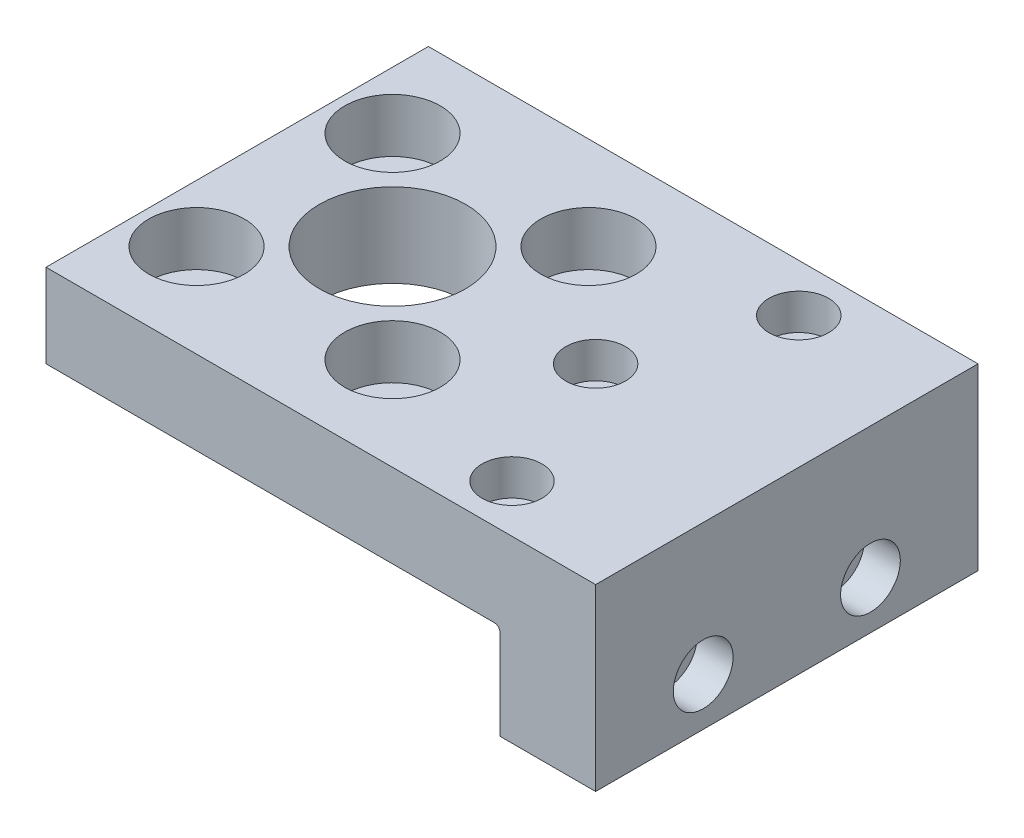
ISO-10303-21;
HEADER;
FILE_DESCRIPTION(('STEP AP214'),'2;1');
FILE_NAME('part.step','',(''),(''),'','','');
FILE_SCHEMA(('AUTOMOTIVE_DESIGN { 1 0 10303 214 1 1 1 1 }'));
ENDSEC;
DATA;
#1=APPLICATION_CONTEXT('core data for automotive mechanical design processes');
#2=APPLICATION_PROTOCOL_DEFINITION('international standard','automotive_design',2000,#1);
#3=PRODUCT_CONTEXT('',#1,'mechanical');
#4=PRODUCT('Part','Part','',(#3));
#5=PRODUCT_RELATED_PRODUCT_CATEGORY('part','',(#4));
#6=PRODUCT_DEFINITION_FORMATION('','',#4);
#7=PRODUCT_DEFINITION_CONTEXT('part definition',#1,'design');
#8=PRODUCT_DEFINITION('design','',#6,#7);
#9=PRODUCT_DEFINITION_SHAPE('','',#8);
#10=(LENGTH_UNIT() NAMED_UNIT(*) SI_UNIT(.MILLI.,.METRE.));
#11=(NAMED_UNIT(*) PLANE_ANGLE_UNIT() SI_UNIT($,.RADIAN.));
#12=(NAMED_UNIT(*) SI_UNIT($,.STERADIAN.) SOLID_ANGLE_UNIT());
#13=UNCERTAINTY_MEASURE_WITH_UNIT(LENGTH_MEASURE(1.E-05),#10,'distance_accuracy_value','');
#14=(GEOMETRIC_REPRESENTATION_CONTEXT(3) GLOBAL_UNCERTAINTY_ASSIGNED_CONTEXT((#13)) GLOBAL_UNIT_ASSIGNED_CONTEXT((#10,
#11,#12)) REPRESENTATION_CONTEXT('',''));
#15=CARTESIAN_POINT('',(0.,0.,0.));
#16=DIRECTION('',(0.,0.,1.));
#17=DIRECTION('',(1.,0.,0.));
#18=AXIS2_PLACEMENT_3D('',#15,#16,#17);
#19=CARTESIAN_POINT('',(-73.025,-23.8125,-22.225));
#20=DIRECTION('',(1.,0.,0.));
#21=DIRECTION('',(0.,0.,-1.));
#22=AXIS2_PLACEMENT_3D('',#19,#20,#21);
#23=CYLINDRICAL_SURFACE('',#22,5.1562);
#24=CARTESIAN_POINT('',(47.625,-23.8125,-22.225));
#25=DIRECTION('',(1.,0.,0.));
#26=DIRECTION('',(0.,0.,-1.));
#27=AXIS2_PLACEMENT_3D('',#24,#25,#26);
#28=CIRCLE('',#27,5.1562);
#29=CARTESIAN_POINT('',(47.625,-23.8125,-27.3812));
#30=VERTEX_POINT('',#29);
#31=EDGE_CURVE('E185',#30,#30,#28,.T.);
#32=ORIENTED_EDGE('',*,*,#31,.F.);
#33=EDGE_LOOP('',(#32));
#34=FACE_BOUND('',#33,.T.);
#35=CARTESIAN_POINT('',(63.5,-23.8125,-22.225));
#36=DIRECTION('',(1.,0.,0.));
#37=DIRECTION('',(0.,0.,-1.));
#38=AXIS2_PLACEMENT_3D('',#35,#36,#37);
#39=CIRCLE('',#38,5.1562);
#40=CARTESIAN_POINT('',(63.5,-23.8125,-27.3812));
#41=VERTEX_POINT('',#40);
#42=EDGE_CURVE('E45',#41,#41,#39,.F.);
#43=ORIENTED_EDGE('',*,*,#42,.F.);
#44=EDGE_LOOP('',(#43));
#45=FACE_BOUND('',#44,.T.);
#46=ADVANCED_FACE('F41',(#34,#45),#23,.F.);
#47=CARTESIAN_POINT('',(-73.025,-23.8125,22.225));
#48=DIRECTION('',(1.,0.,0.));
#49=DIRECTION('',(0.,0.,-1.));
#50=AXIS2_PLACEMENT_3D('',#47,#48,#49);
#51=CYLINDRICAL_SURFACE('',#50,5.1562);
#52=CARTESIAN_POINT('',(47.625,-23.8125,22.225));
#53=DIRECTION('',(1.,0.,0.));
#54=DIRECTION('',(0.,0.,-1.));
#55=AXIS2_PLACEMENT_3D('',#52,#53,#54);
#56=CIRCLE('',#55,5.1562);
#57=CARTESIAN_POINT('',(47.625,-23.8125,17.0688));
#58=VERTEX_POINT('',#57);
#59=EDGE_CURVE('E188',#58,#58,#56,.T.);
#60=ORIENTED_EDGE('',*,*,#59,.F.);
#61=EDGE_LOOP('',(#60));
#62=FACE_BOUND('',#61,.T.);
#63=CARTESIAN_POINT('',(63.5,-23.8125,22.225));
#64=DIRECTION('',(1.,0.,0.));
#65=DIRECTION('',(0.,0.,-1.));
#66=AXIS2_PLACEMENT_3D('',#63,#64,#65);
#67=CIRCLE('',#66,5.1562);
#68=CARTESIAN_POINT('',(63.5,-23.8125,17.0688));
#69=VERTEX_POINT('',#68);
#70=EDGE_CURVE('E191',#69,#69,#67,.F.);
#71=ORIENTED_EDGE('',*,*,#70,.F.);
#72=EDGE_LOOP('',(#71));
#73=FACE_BOUND('',#72,.T.);
#74=ADVANCED_FACE('F311',(#62,#73),#51,.F.);
#75=CARTESIAN_POINT('',(22.225,-36.5125,0.));
#76=DIRECTION('',(0.,1.,0.));
#77=DIRECTION('',(0.,0.,1.));
#78=AXIS2_PLACEMENT_3D('',#75,#76,#77);
#79=CYLINDRICAL_SURFACE('',#78,5.1562);
#80=CARTESIAN_POINT('',(22.225,-11.1125,0.));
#81=DIRECTION('',(0.,-1.,0.));
#82=DIRECTION('',(0.,0.,-1.));
#83=AXIS2_PLACEMENT_3D('',#80,#81,#82);
#84=CIRCLE('',#83,5.1562);
#85=CARTESIAN_POINT('',(22.225,-11.1125,-5.1562));
#86=VERTEX_POINT('',#85);
#87=EDGE_CURVE('E183',#86,#86,#84,.T.);
#88=ORIENTED_EDGE('',*,*,#87,.T.);
#89=EDGE_LOOP('',(#88));
#90=FACE_BOUND('',#89,.T.);
#91=CARTESIAN_POINT('',(22.225,1.5875,0.));
#92=DIRECTION('',(0.,1.,0.));
#93=DIRECTION('',(0.,0.,1.));
#94=AXIS2_PLACEMENT_3D('',#91,#92,#93);
#95=CIRCLE('',#94,5.1562);
#96=CARTESIAN_POINT('',(22.225,1.5875,5.1562));
#97=VERTEX_POINT('',#96);
#98=EDGE_CURVE('E180',#97,#97,#95,.F.);
#99=ORIENTED_EDGE('',*,*,#98,.F.);
#100=EDGE_LOOP('',(#99));
#101=FACE_BOUND('',#100,.T.);
#102=ADVANCED_FACE('F318',(#90,#101),#79,.F.);
#103=CARTESIAN_POINT('',(38.1,-36.5125,-38.1));
#104=DIRECTION('',(0.,1.,0.));
#105=DIRECTION('',(0.,0.,1.));
#106=AXIS2_PLACEMENT_3D('',#103,#104,#105);
#107=CYLINDRICAL_SURFACE('',#106,5.1562);
#108=CARTESIAN_POINT('',(38.1,-11.1125,-38.1));
#109=DIRECTION('',(0.,-1.,0.));
#110=DIRECTION('',(0.,0.,-1.));
#111=AXIS2_PLACEMENT_3D('',#108,#109,#110);
#112=CIRCLE('',#111,5.1562);
#113=CARTESIAN_POINT('',(38.1,-11.1125,-43.2562));
#114=VERTEX_POINT('',#113);
#115=EDGE_CURVE('E179',#114,#114,#112,.T.);
#116=ORIENTED_EDGE('',*,*,#115,.T.);
#117=EDGE_LOOP('',(#116));
#118=FACE_BOUND('',#117,.T.);
#119=CARTESIAN_POINT('',(38.1,1.5875,-38.1));
#120=DIRECTION('',(0.,1.,0.));
#121=DIRECTION('',(0.,0.,1.));
#122=AXIS2_PLACEMENT_3D('',#119,#120,#121);
#123=CIRCLE('',#122,5.1562);
#124=CARTESIAN_POINT('',(38.1,1.5875,-32.9438));
#125=VERTEX_POINT('',#124);
#126=EDGE_CURVE('E175',#125,#125,#123,.F.);
#127=ORIENTED_EDGE('',*,*,#126,.F.);
#128=EDGE_LOOP('',(#127));
#129=FACE_BOUND('',#128,.T.);
#130=ADVANCED_FACE('F337',(#118,#129),#107,.F.);
#131=CARTESIAN_POINT('',(38.1,-36.5125,38.1));
#132=DIRECTION('',(0.,1.,0.));
#133=DIRECTION('',(0.,0.,1.));
#134=AXIS2_PLACEMENT_3D('',#131,#132,#133);
#135=CYLINDRICAL_SURFACE('',#134,5.1562);
#136=CARTESIAN_POINT('',(38.1,-11.1125,38.1));
#137=DIRECTION('',(0.,-1.,0.));
#138=DIRECTION('',(0.,0.,-1.));
#139=AXIS2_PLACEMENT_3D('',#136,#137,#138);
#140=CIRCLE('',#139,5.1562);
#141=CARTESIAN_POINT('',(38.1,-11.1125,32.9438));
#142=VERTEX_POINT('',#141);
#143=EDGE_CURVE('E230',#142,#142,#140,.T.);
#144=ORIENTED_EDGE('',*,*,#143,.T.);
#145=EDGE_LOOP('',(#144));
#146=FACE_BOUND('',#145,.T.);
#147=CARTESIAN_POINT('',(38.1,1.5875,38.1));
#148=DIRECTION('',(0.,1.,0.));
#149=DIRECTION('',(0.,0.,1.));
#150=AXIS2_PLACEMENT_3D('',#147,#148,#149);
#151=CIRCLE('',#150,5.1562);
#152=CARTESIAN_POINT('',(38.1,1.5875,43.2562));
#153=VERTEX_POINT('',#152);
#154=EDGE_CURVE('E172',#153,#153,#151,.F.);
#155=ORIENTED_EDGE('',*,*,#154,.F.);
#156=EDGE_LOOP('',(#155));
#157=FACE_BOUND('',#156,.T.);
#158=ADVANCED_FACE('F355',(#146,#157),#135,.F.);
#159=CARTESIAN_POINT('',(-57.785,-36.5125,26.035));
#160=DIRECTION('',(0.,1.,0.));
#161=DIRECTION('',(0.,0.,1.));
#162=AXIS2_PLACEMENT_3D('',#159,#160,#161);
#163=CYLINDRICAL_SURFACE('',#162,6.7437);
#164=CARTESIAN_POINT('',(-57.785,-11.1125,26.035));
#165=DIRECTION('',(0.,-1.,0.));
#166=DIRECTION('',(0.,0.,-1.));
#167=AXIS2_PLACEMENT_3D('',#164,#165,#166);
#168=CIRCLE('',#167,6.7437);
#169=CARTESIAN_POINT('',(-57.785,-11.1125,19.2913));
#170=VERTEX_POINT('',#169);
#171=EDGE_CURVE('E171',#170,#170,#168,.T.);
#172=ORIENTED_EDGE('',*,*,#171,.T.);
#173=EDGE_LOOP('',(#172));
#174=FACE_BOUND('',#173,.T.);
#175=CARTESIAN_POINT('',(-57.785,-3.175,26.035));
#176=DIRECTION('',(0.,1.,0.));
#177=DIRECTION('',(0.,0.,1.));
#178=AXIS2_PLACEMENT_3D('',#175,#176,#177);
#179=CIRCLE('',#178,6.7437);
#180=CARTESIAN_POINT('',(-57.785,-3.175,32.7787));
#181=VERTEX_POINT('',#180);
#182=EDGE_CURVE('E168',#181,#181,#179,.F.);
#183=ORIENTED_EDGE('',*,*,#182,.F.);
#184=EDGE_LOOP('',(#183));
#185=FACE_BOUND('',#184,.T.);
#186=ADVANCED_FACE('F358',(#174,#185),#163,.F.);
#187=CARTESIAN_POINT('',(-5.715,-36.5125,-26.035));
#188=DIRECTION('',(0.,1.,0.));
#189=DIRECTION('',(0.,0.,1.));
#190=AXIS2_PLACEMENT_3D('',#187,#188,#189);
#191=CYLINDRICAL_SURFACE('',#190,6.7437);
#192=CARTESIAN_POINT('',(-5.715,-11.1125,-26.035));
#193=DIRECTION('',(0.,-1.,0.));
#194=DIRECTION('',(0.,0.,-1.));
#195=AXIS2_PLACEMENT_3D('',#192,#193,#194);
#196=CIRCLE('',#195,6.7437);
#197=CARTESIAN_POINT('',(-5.715,-11.1125,-32.7787));
#198=VERTEX_POINT('',#197);
#199=EDGE_CURVE('E258',#198,#198,#196,.T.);
#200=ORIENTED_EDGE('',*,*,#199,.T.);
#201=EDGE_LOOP('',(#200));
#202=FACE_BOUND('',#201,.T.);
#203=CARTESIAN_POINT('',(-5.715,-3.175,-26.035));
#204=DIRECTION('',(0.,1.,0.));
#205=DIRECTION('',(0.,0.,1.));
#206=AXIS2_PLACEMENT_3D('',#203,#204,#205);
#207=CIRCLE('',#206,6.7437);
#208=CARTESIAN_POINT('',(-5.715,-3.175,-19.2913));
#209=VERTEX_POINT('',#208);
#210=EDGE_CURVE('E165',#209,#209,#207,.F.);
#211=ORIENTED_EDGE('',*,*,#210,.F.);
#212=EDGE_LOOP('',(#211));
#213=FACE_BOUND('',#212,.T.);
#214=ADVANCED_FACE('F393',(#202,#213),#191,.F.);
#215=CARTESIAN_POINT('',(-57.785,-36.5125,-26.035));
#216=DIRECTION('',(0.,1.,0.));
#217=DIRECTION('',(0.,0.,1.));
#218=AXIS2_PLACEMENT_3D('',#215,#216,#217);
#219=CYLINDRICAL_SURFACE('',#218,6.7437);
#220=CARTESIAN_POINT('',(-57.785,-11.1125,-26.035));
#221=DIRECTION('',(0.,-1.,0.));
#222=DIRECTION('',(0.,0.,-1.));
#223=AXIS2_PLACEMENT_3D('',#220,#221,#222);
#224=CIRCLE('',#223,6.7437);
#225=CARTESIAN_POINT('',(-57.785,-11.1125,-32.7787));
#226=VERTEX_POINT('',#225);
#227=EDGE_CURVE('E261',#226,#226,#224,.T.);
#228=ORIENTED_EDGE('',*,*,#227,.T.);
#229=EDGE_LOOP('',(#228));
#230=FACE_BOUND('',#229,.T.);
#231=CARTESIAN_POINT('',(-57.785,-3.175,-26.035));
#232=DIRECTION('',(0.,1.,0.));
#233=DIRECTION('',(0.,0.,1.));
#234=AXIS2_PLACEMENT_3D('',#231,#232,#233);
#235=CIRCLE('',#234,6.7437);
#236=CARTESIAN_POINT('',(-57.785,-3.175,-19.2913));
#237=VERTEX_POINT('',#236);
#238=EDGE_CURVE('E161',#237,#237,#235,.F.);
#239=ORIENTED_EDGE('',*,*,#238,.F.);
#240=EDGE_LOOP('',(#239));
#241=FACE_BOUND('',#240,.T.);
#242=ADVANCED_FACE('F396',(#230,#241),#219,.F.);
#243=CARTESIAN_POINT('',(-5.715,-36.5125,26.035));
#244=DIRECTION('',(0.,1.,0.));
#245=DIRECTION('',(0.,0.,1.));
#246=AXIS2_PLACEMENT_3D('',#243,#244,#245);
#247=CYLINDRICAL_SURFACE('',#246,6.7437);
#248=CARTESIAN_POINT('',(-5.715,-11.1125,26.035));
#249=DIRECTION('',(0.,-1.,0.));
#250=DIRECTION('',(0.,0.,-1.));
#251=AXIS2_PLACEMENT_3D('',#248,#249,#250);
#252=CIRCLE('',#251,6.7437);
#253=CARTESIAN_POINT('',(-5.715,-11.1125,19.2913));
#254=VERTEX_POINT('',#253);
#255=EDGE_CURVE('E264',#254,#254,#252,.T.);
#256=ORIENTED_EDGE('',*,*,#255,.T.);
#257=EDGE_LOOP('',(#256));
#258=FACE_BOUND('',#257,.T.);
#259=CARTESIAN_POINT('',(-5.715,-3.175,26.035));
#260=DIRECTION('',(0.,1.,0.));
#261=DIRECTION('',(0.,0.,1.));
#262=AXIS2_PLACEMENT_3D('',#259,#260,#261);
#263=CIRCLE('',#262,6.7437);
#264=CARTESIAN_POINT('',(-5.715,-3.175,32.7787));
#265=VERTEX_POINT('',#264);
#266=EDGE_CURVE('E158',#265,#265,#263,.F.);
#267=ORIENTED_EDGE('',*,*,#266,.F.);
#268=EDGE_LOOP('',(#267));
#269=FACE_BOUND('',#268,.T.);
#270=ADVANCED_FACE('F398',(#258,#269),#247,.F.);
#271=CARTESIAN_POINT('',(0.,-11.1125,0.));
#272=DIRECTION('',(0.,-1.,0.));
#273=DIRECTION('',(0.,0.,-1.));
#274=AXIS2_PLACEMENT_3D('',#271,#272,#273);
#275=PLANE('',#274);
#276=ORIENTED_EDGE('',*,*,#87,.F.);
#277=EDGE_LOOP('',(#276));
#278=FACE_BOUND('',#277,.T.);
#279=ORIENTED_EDGE('',*,*,#143,.F.);
#280=EDGE_LOOP('',(#279));
#281=FACE_BOUND('',#280,.T.);
#282=ORIENTED_EDGE('',*,*,#115,.F.);
#283=EDGE_LOOP('',(#282));
#284=FACE_BOUND('',#283,.T.);
#285=ORIENTED_EDGE('',*,*,#255,.F.);
#286=EDGE_LOOP('',(#285));
#287=FACE_BOUND('',#286,.T.);
#288=ORIENTED_EDGE('',*,*,#227,.F.);
#289=EDGE_LOOP('',(#288));
#290=FACE_BOUND('',#289,.T.);
#291=ORIENTED_EDGE('',*,*,#199,.F.);
#292=EDGE_LOOP('',(#291));
#293=FACE_BOUND('',#292,.T.);
#294=ORIENTED_EDGE('',*,*,#171,.F.);
#295=EDGE_LOOP('',(#294));
#296=FACE_BOUND('',#295,.T.);
#297=CARTESIAN_POINT('',(-31.75,-11.1125,0.));
#298=DIRECTION('',(0.,-1.,0.));
#299=DIRECTION('',(0.,0.,-1.));
#300=AXIS2_PLACEMENT_3D('',#297,#298,#299);
#301=CIRCLE('',#300,19.4437);
#302=CARTESIAN_POINT('',(-31.75,-11.1125,-19.4437));
#303=VERTEX_POINT('',#302);
#304=EDGE_CURVE('E121',#303,#303,#301,.F.);
#305=ORIENTED_EDGE('',*,*,#304,.T.);
#306=EDGE_LOOP('',(#305));
#307=FACE_BOUND('',#306,.T.);
#308=DIRECTION('',(-1.,0.,0.));
#309=VECTOR('',#308,1.);
#310=CARTESIAN_POINT('',(-73.025,-11.1125,-50.8));
#311=LINE('',#310,#309);
#312=CARTESIAN_POINT('',(46.101,-11.1125,-50.8));
#313=VERTEX_POINT('',#312);
#314=CARTESIAN_POINT('',(-73.025,-11.1125,-50.8));
#315=VERTEX_POINT('',#314);
#316=EDGE_CURVE('E105',#313,#315,#311,.T.);
#317=ORIENTED_EDGE('',*,*,#316,.F.);
#318=DIRECTION('',(0.,0.,1.));
#319=VECTOR('',#318,1.);
#320=CARTESIAN_POINT('',(46.101,-11.1125,0.));
#321=LINE('',#320,#319);
#322=CARTESIAN_POINT('',(46.101,-11.1125,50.8));
#323=VERTEX_POINT('',#322);
#324=EDGE_CURVE('E153',#313,#323,#321,.T.);
#325=ORIENTED_EDGE('',*,*,#324,.T.);
#326=DIRECTION('',(1.,0.,0.));
#327=VECTOR('',#326,1.);
#328=CARTESIAN_POINT('',(-73.025,-11.1125,50.8));
#329=LINE('',#328,#327);
#330=CARTESIAN_POINT('',(-73.025,-11.1125,50.8));
#331=VERTEX_POINT('',#330);
#332=EDGE_CURVE('E133',#331,#323,#329,.T.);
#333=ORIENTED_EDGE('',*,*,#332,.F.);
#334=DIRECTION('',(0.,0.,1.));
#335=VECTOR('',#334,1.);
#336=CARTESIAN_POINT('',(-73.025,-11.1125,50.8));
#337=LINE('',#336,#335);
#338=EDGE_CURVE('E141',#315,#331,#337,.T.);
#339=ORIENTED_EDGE('',*,*,#338,.F.);
#340=EDGE_LOOP('',(#317,#325,#333,#339));
#341=FACE_BOUND('',#340,.T.);
#342=ADVANCED_FACE('F271',(#278,#281,#284,#287,#290,#293,#296,#307,#341),#275,.T.);
#343=CARTESIAN_POINT('',(73.025,11.1125,50.8));
#344=DIRECTION('',(-1.,0.,0.));
#345=DIRECTION('',(0.,0.,1.));
#346=AXIS2_PLACEMENT_3D('',#343,#344,#345);
#347=PLANE('',#346);
#348=CARTESIAN_POINT('',(73.025,-23.8125,22.225));
#349=DIRECTION('',(1.,0.,0.));
#350=DIRECTION('',(0.,0.,-1.));
#351=AXIS2_PLACEMENT_3D('',#348,#349,#350);
#352=CIRCLE('',#351,7.9375);
#353=CARTESIAN_POINT('',(73.025,-23.8125,14.2875));
#354=VERTEX_POINT('',#353);
#355=EDGE_CURVE('E198',#354,#354,#352,.T.);
#356=ORIENTED_EDGE('',*,*,#355,.F.);
#357=EDGE_LOOP('',(#356));
#358=FACE_BOUND('',#357,.T.);
#359=CARTESIAN_POINT('',(73.025,-23.8125,-22.225));
#360=DIRECTION('',(1.,0.,0.));
#361=DIRECTION('',(0.,0.,-1.));
#362=AXIS2_PLACEMENT_3D('',#359,#360,#361);
#363=CIRCLE('',#362,7.9375);
#364=CARTESIAN_POINT('',(73.025,-23.8125,-30.1625));
#365=VERTEX_POINT('',#364);
#366=EDGE_CURVE('E203',#365,#365,#363,.T.);
#367=ORIENTED_EDGE('',*,*,#366,.F.);
#368=EDGE_LOOP('',(#367));
#369=FACE_BOUND('',#368,.T.);
#370=DIRECTION('',(0.,-1.,0.));
#371=VECTOR('',#370,1.);
#372=CARTESIAN_POINT('',(73.025,11.1125,50.8));
#373=LINE('',#372,#371);
#374=CARTESIAN_POINT('',(73.025,11.1125,50.8));
#375=VERTEX_POINT('',#374);
#376=CARTESIAN_POINT('',(73.025,-36.5125,50.8));
#377=VERTEX_POINT('',#376);
#378=EDGE_CURVE('E139',#375,#377,#373,.T.);
#379=ORIENTED_EDGE('',*,*,#378,.T.);
#380=DIRECTION('',(0.,0.,-1.));
#381=VECTOR('',#380,1.);
#382=CARTESIAN_POINT('',(73.025,-36.5125,50.8));
#383=LINE('',#382,#381);
#384=CARTESIAN_POINT('',(73.025,-36.5125,-50.8));
#385=VERTEX_POINT('',#384);
#386=EDGE_CURVE('E114',#377,#385,#383,.T.);
#387=ORIENTED_EDGE('',*,*,#386,.T.);
#388=DIRECTION('',(0.,-1.,0.));
#389=VECTOR('',#388,1.);
#390=CARTESIAN_POINT('',(73.025,11.1125,-50.8));
#391=LINE('',#390,#389);
#392=CARTESIAN_POINT('',(73.025,11.1125,-50.8));
#393=VERTEX_POINT('',#392);
#394=EDGE_CURVE('E151',#393,#385,#391,.T.);
#395=ORIENTED_EDGE('',*,*,#394,.F.);
#396=DIRECTION('',(0.,0.,-1.));
#397=VECTOR('',#396,1.);
#398=CARTESIAN_POINT('',(73.025,11.1125,50.8));
#399=LINE('',#398,#397);
#400=EDGE_CURVE('E129',#375,#393,#399,.T.);
#401=ORIENTED_EDGE('',*,*,#400,.F.);
#402=EDGE_LOOP('',(#379,#387,#395,#401));
#403=FACE_BOUND('',#402,.T.);
#404=ADVANCED_FACE('F291',(#358,#369,#403),#347,.F.);
#405=CARTESIAN_POINT('',(-73.025,11.1125,-50.8));
#406=DIRECTION('',(0.,0.,1.));
#407=DIRECTION('',(1.,0.,0.));
#408=AXIS2_PLACEMENT_3D('',#405,#406,#407);
#409=PLANE('',#408);
#410=ORIENTED_EDGE('',*,*,#394,.T.);
#411=DIRECTION('',(-1.,0.,0.));
#412=VECTOR('',#411,1.);
#413=CARTESIAN_POINT('',(47.625,-36.5125,-50.8));
#414=LINE('',#413,#412);
#415=CARTESIAN_POINT('',(47.625,-36.5125,-50.8));
#416=VERTEX_POINT('',#415);
#417=EDGE_CURVE('E126',#385,#416,#414,.T.);
#418=ORIENTED_EDGE('',*,*,#417,.T.);
#419=DIRECTION('',(0.,-1.,0.));
#420=VECTOR('',#419,1.);
#421=CARTESIAN_POINT('',(47.625,-11.1125,-50.8));
#422=LINE('',#421,#420);
#423=CARTESIAN_POINT('',(47.625,-12.6365,-50.8));
#424=VERTEX_POINT('',#423);
#425=EDGE_CURVE('E106',#424,#416,#422,.T.);
#426=ORIENTED_EDGE('',*,*,#425,.F.);
#427=CARTESIAN_POINT('',(46.101,-12.6365,-50.8));
#428=DIRECTION('',(0.,0.,1.));
#429=DIRECTION('',(1.,0.,0.));
#430=AXIS2_PLACEMENT_3D('',#427,#428,#429);
#431=CIRCLE('',#430,1.524);
#432=EDGE_CURVE('E11',#424,#313,#431,.T.);
#433=ORIENTED_EDGE('',*,*,#432,.T.);
#434=ORIENTED_EDGE('',*,*,#316,.T.);
#435=DIRECTION('',(0.,-1.,0.));
#436=VECTOR('',#435,1.);
#437=CARTESIAN_POINT('',(-73.025,11.1125,-50.8));
#438=LINE('',#437,#436);
#439=CARTESIAN_POINT('',(-73.025,11.1125,-50.8));
#440=VERTEX_POINT('',#439);
#441=EDGE_CURVE('E148',#440,#315,#438,.T.);
#442=ORIENTED_EDGE('',*,*,#441,.F.);
#443=DIRECTION('',(-1.,0.,0.));
#444=VECTOR('',#443,1.);
#445=CARTESIAN_POINT('',(-73.025,11.1125,-50.8));
#446=LINE('',#445,#444);
#447=EDGE_CURVE('E132',#393,#440,#446,.T.);
#448=ORIENTED_EDGE('',*,*,#447,.F.);
#449=EDGE_LOOP('',(#410,#418,#426,#433,#434,#442,#448));
#450=FACE_BOUND('',#449,.T.);
#451=ADVANCED_FACE('F293',(#450),#409,.F.);
#452=CARTESIAN_POINT('',(-73.025,11.1125,50.8));
#453=DIRECTION('',(1.,0.,0.));
#454=DIRECTION('',(0.,0.,-1.));
#455=AXIS2_PLACEMENT_3D('',#452,#453,#454);
#456=PLANE('',#455);
#457=ORIENTED_EDGE('',*,*,#338,.T.);
#458=DIRECTION('',(0.,-1.,0.));
#459=VECTOR('',#458,1.);
#460=CARTESIAN_POINT('',(-73.025,11.1125,50.8));
#461=LINE('',#460,#459);
#462=CARTESIAN_POINT('',(-73.025,11.1125,50.8));
#463=VERTEX_POINT('',#462);
#464=EDGE_CURVE('E145',#463,#331,#461,.T.);
#465=ORIENTED_EDGE('',*,*,#464,.F.);
#466=DIRECTION('',(0.,0.,1.));
#467=VECTOR('',#466,1.);
#468=CARTESIAN_POINT('',(-73.025,11.1125,50.8));
#469=LINE('',#468,#467);
#470=EDGE_CURVE('E135',#440,#463,#469,.T.);
#471=ORIENTED_EDGE('',*,*,#470,.F.);
#472=ORIENTED_EDGE('',*,*,#441,.T.);
#473=EDGE_LOOP('',(#457,#465,#471,#472));
#474=FACE_BOUND('',#473,.T.);
#475=ADVANCED_FACE('F299',(#474),#456,.F.);
#476=CARTESIAN_POINT('',(-73.025,11.1125,50.8));
#477=DIRECTION('',(0.,0.,-1.));
#478=DIRECTION('',(-1.,0.,0.));
#479=AXIS2_PLACEMENT_3D('',#476,#477,#478);
#480=PLANE('',#479);
#481=ORIENTED_EDGE('',*,*,#332,.T.);
#482=CARTESIAN_POINT('',(46.101,-12.6365,50.8));
#483=DIRECTION('',(0.,0.,-1.));
#484=DIRECTION('',(-1.,0.,0.));
#485=AXIS2_PLACEMENT_3D('',#482,#483,#484);
#486=CIRCLE('',#485,1.524);
#487=CARTESIAN_POINT('',(47.625,-12.6365,50.8));
#488=VERTEX_POINT('',#487);
#489=EDGE_CURVE('E50',#323,#488,#486,.T.);
#490=ORIENTED_EDGE('',*,*,#489,.T.);
#491=DIRECTION('',(0.,-1.,0.));
#492=VECTOR('',#491,1.);
#493=CARTESIAN_POINT('',(47.625,-11.1125,50.8));
#494=LINE('',#493,#492);
#495=CARTESIAN_POINT('',(47.625,-36.5125,50.8));
#496=VERTEX_POINT('',#495);
#497=EDGE_CURVE('E98',#488,#496,#494,.T.);
#498=ORIENTED_EDGE('',*,*,#497,.T.);
#499=DIRECTION('',(1.,0.,0.));
#500=VECTOR('',#499,1.);
#501=CARTESIAN_POINT('',(47.625,-36.5125,50.8));
#502=LINE('',#501,#500);
#503=EDGE_CURVE('E102',#496,#377,#502,.T.);
#504=ORIENTED_EDGE('',*,*,#503,.T.);
#505=ORIENTED_EDGE('',*,*,#378,.F.);
#506=DIRECTION('',(1.,0.,0.));
#507=VECTOR('',#506,1.);
#508=CARTESIAN_POINT('',(-73.025,11.1125,50.8));
#509=LINE('',#508,#507);
#510=EDGE_CURVE('E137',#463,#375,#509,.T.);
#511=ORIENTED_EDGE('',*,*,#510,.F.);
#512=ORIENTED_EDGE('',*,*,#464,.T.);
#513=EDGE_LOOP('',(#481,#490,#498,#504,#505,#511,#512));
#514=FACE_BOUND('',#513,.T.);
#515=ADVANCED_FACE('F100',(#514),#480,.F.);
#516=CARTESIAN_POINT('',(0.,11.1125,0.));
#517=DIRECTION('',(0.,-1.,0.));
#518=DIRECTION('',(0.,0.,-1.));
#519=AXIS2_PLACEMENT_3D('',#516,#517,#518);
#520=PLANE('',#519);
#521=CARTESIAN_POINT('',(22.225,11.1125,0.));
#522=DIRECTION('',(0.,1.,0.));
#523=DIRECTION('',(0.,0.,1.));
#524=AXIS2_PLACEMENT_3D('',#521,#522,#523);
#525=CIRCLE('',#524,7.9375);
#526=CARTESIAN_POINT('',(22.225,11.1125,7.9375));
#527=VERTEX_POINT('',#526);
#528=EDGE_CURVE('E190',#527,#527,#525,.T.);
#529=ORIENTED_EDGE('',*,*,#528,.F.);
#530=EDGE_LOOP('',(#529));
#531=FACE_BOUND('',#530,.T.);
#532=CARTESIAN_POINT('',(38.1,11.1125,38.1));
#533=DIRECTION('',(0.,1.,0.));
#534=DIRECTION('',(0.,0.,1.));
#535=AXIS2_PLACEMENT_3D('',#532,#533,#534);
#536=CIRCLE('',#535,7.9375);
#537=CARTESIAN_POINT('',(38.1,11.1125,46.0375));
#538=VERTEX_POINT('',#537);
#539=EDGE_CURVE('E220',#538,#538,#536,.T.);
#540=ORIENTED_EDGE('',*,*,#539,.F.);
#541=EDGE_LOOP('',(#540));
#542=FACE_BOUND('',#541,.T.);
#543=CARTESIAN_POINT('',(38.1,11.1125,-38.1));
#544=DIRECTION('',(0.,1.,0.));
#545=DIRECTION('',(0.,0.,1.));
#546=AXIS2_PLACEMENT_3D('',#543,#544,#545);
#547=CIRCLE('',#546,7.9375);
#548=CARTESIAN_POINT('',(38.1,11.1125,-30.1625));
#549=VERTEX_POINT('',#548);
#550=EDGE_CURVE('E223',#549,#549,#547,.T.);
#551=ORIENTED_EDGE('',*,*,#550,.F.);
#552=EDGE_LOOP('',(#551));
#553=FACE_BOUND('',#552,.T.);
#554=CARTESIAN_POINT('',(-5.715,11.1125,26.035));
#555=DIRECTION('',(0.,1.,0.));
#556=DIRECTION('',(0.,0.,1.));
#557=AXIS2_PLACEMENT_3D('',#554,#555,#556);
#558=CIRCLE('',#557,12.7);
#559=CARTESIAN_POINT('',(-5.715,11.1125,38.735));
#560=VERTEX_POINT('',#559);
#561=EDGE_CURVE('E240',#560,#560,#558,.T.);
#562=ORIENTED_EDGE('',*,*,#561,.F.);
#563=EDGE_LOOP('',(#562));
#564=FACE_BOUND('',#563,.T.);
#565=CARTESIAN_POINT('',(-57.785,11.1125,-26.035));
#566=DIRECTION('',(0.,1.,0.));
#567=DIRECTION('',(0.,0.,1.));
#568=AXIS2_PLACEMENT_3D('',#565,#566,#567);
#569=CIRCLE('',#568,12.7);
#570=CARTESIAN_POINT('',(-57.785,11.1125,-13.335));
#571=VERTEX_POINT('',#570);
#572=EDGE_CURVE('E247',#571,#571,#569,.T.);
#573=ORIENTED_EDGE('',*,*,#572,.F.);
#574=EDGE_LOOP('',(#573));
#575=FACE_BOUND('',#574,.T.);
#576=CARTESIAN_POINT('',(-5.715,11.1125,-26.035));
#577=DIRECTION('',(0.,1.,0.));
#578=DIRECTION('',(0.,0.,1.));
#579=AXIS2_PLACEMENT_3D('',#576,#577,#578);
#580=CIRCLE('',#579,12.7);
#581=CARTESIAN_POINT('',(-5.715,11.1125,-13.335));
#582=VERTEX_POINT('',#581);
#583=EDGE_CURVE('E234',#582,#582,#580,.T.);
#584=ORIENTED_EDGE('',*,*,#583,.F.);
#585=EDGE_LOOP('',(#584));
#586=FACE_BOUND('',#585,.T.);
#587=CARTESIAN_POINT('',(-57.785,11.1125,26.035));
#588=DIRECTION('',(0.,1.,0.));
#589=DIRECTION('',(0.,0.,1.));
#590=AXIS2_PLACEMENT_3D('',#587,#588,#589);
#591=CIRCLE('',#590,12.7);
#592=CARTESIAN_POINT('',(-57.785,11.1125,38.735));
#593=VERTEX_POINT('',#592);
#594=EDGE_CURVE('E243',#593,#593,#591,.T.);
#595=ORIENTED_EDGE('',*,*,#594,.F.);
#596=EDGE_LOOP('',(#595));
#597=FACE_BOUND('',#596,.T.);
#598=CARTESIAN_POINT('',(-31.75,11.1125,0.));
#599=DIRECTION('',(0.,1.,0.));
#600=DIRECTION('',(0.,0.,1.));
#601=AXIS2_PLACEMENT_3D('',#598,#599,#600);
#602=CIRCLE('',#601,19.4437);
#603=CARTESIAN_POINT('',(-31.75,11.1125,19.4437));
#604=VERTEX_POINT('',#603);
#605=EDGE_CURVE('E118',#604,#604,#602,.T.);
#606=ORIENTED_EDGE('',*,*,#605,.F.);
#607=EDGE_LOOP('',(#606));
#608=FACE_BOUND('',#607,.T.);
#609=ORIENTED_EDGE('',*,*,#400,.T.);
#610=ORIENTED_EDGE('',*,*,#447,.T.);
#611=ORIENTED_EDGE('',*,*,#470,.T.);
#612=ORIENTED_EDGE('',*,*,#510,.T.);
#613=EDGE_LOOP('',(#609,#610,#611,#612));
#614=FACE_BOUND('',#613,.T.);
#615=ADVANCED_FACE('F281',(#531,#542,#553,#564,#575,#586,#597,#608,#614),#520,.F.);
#616=CARTESIAN_POINT('',(47.625,-11.1125,50.8));
#617=DIRECTION('',(1.,0.,0.));
#618=DIRECTION('',(0.,0.,-1.));
#619=AXIS2_PLACEMENT_3D('',#616,#617,#618);
#620=PLANE('',#619);
#621=ORIENTED_EDGE('',*,*,#59,.T.);
#622=EDGE_LOOP('',(#621));
#623=FACE_BOUND('',#622,.T.);
#624=ORIENTED_EDGE('',*,*,#31,.T.);
#625=EDGE_LOOP('',(#624));
#626=FACE_BOUND('',#625,.T.);
#627=ORIENTED_EDGE('',*,*,#497,.F.);
#628=DIRECTION('',(0.,0.,1.));
#629=VECTOR('',#628,1.);
#630=CARTESIAN_POINT('',(47.625,-12.6365,50.8));
#631=LINE('',#630,#629);
#632=EDGE_CURVE('E58',#488,#424,#631,.F.);
#633=ORIENTED_EDGE('',*,*,#632,.T.);
#634=ORIENTED_EDGE('',*,*,#425,.T.);
#635=DIRECTION('',(0.,0.,1.));
#636=VECTOR('',#635,1.);
#637=CARTESIAN_POINT('',(47.625,-36.5125,50.8));
#638=LINE('',#637,#636);
#639=EDGE_CURVE('E112',#416,#496,#638,.T.);
#640=ORIENTED_EDGE('',*,*,#639,.T.);
#641=EDGE_LOOP('',(#627,#633,#634,#640));
#642=FACE_BOUND('',#641,.T.);
#643=ADVANCED_FACE('F116',(#623,#626,#642),#620,.F.);
#644=CARTESIAN_POINT('',(0.,-36.5125,0.));
#645=DIRECTION('',(0.,-1.,0.));
#646=DIRECTION('',(0.,0.,-1.));
#647=AXIS2_PLACEMENT_3D('',#644,#645,#646);
#648=PLANE('',#647);
#649=ORIENTED_EDGE('',*,*,#639,.F.);
#650=ORIENTED_EDGE('',*,*,#417,.F.);
#651=ORIENTED_EDGE('',*,*,#386,.F.);
#652=ORIENTED_EDGE('',*,*,#503,.F.);
#653=EDGE_LOOP('',(#649,#650,#651,#652));
#654=FACE_BOUND('',#653,.T.);
#655=ADVANCED_FACE('F110',(#654),#648,.T.);
#656=CARTESIAN_POINT('',(46.101,-12.6365,0.));
#657=DIRECTION('',(0.,0.,1.));
#658=DIRECTION('',(1.,0.,0.));
#659=AXIS2_PLACEMENT_3D('',#656,#657,#658);
#660=CYLINDRICAL_SURFACE('',#659,1.524);
#661=ORIENTED_EDGE('',*,*,#432,.F.);
#662=ORIENTED_EDGE('',*,*,#632,.F.);
#663=ORIENTED_EDGE('',*,*,#489,.F.);
#664=ORIENTED_EDGE('',*,*,#324,.F.);
#665=EDGE_LOOP('',(#661,#662,#663,#664));
#666=FACE_BOUND('',#665,.T.);
#667=ADVANCED_FACE('F43',(#666),#660,.F.);
#668=CARTESIAN_POINT('',(-31.75,-36.5125,0.));
#669=DIRECTION('',(0.,1.,0.));
#670=DIRECTION('',(0.,0.,1.));
#671=AXIS2_PLACEMENT_3D('',#668,#669,#670);
#672=CYLINDRICAL_SURFACE('',#671,19.4437);
#673=ORIENTED_EDGE('',*,*,#304,.F.);
#674=EDGE_LOOP('',(#673));
#675=FACE_BOUND('',#674,.T.);
#676=ORIENTED_EDGE('',*,*,#605,.T.);
#677=EDGE_LOOP('',(#676));
#678=FACE_BOUND('',#677,.T.);
#679=ADVANCED_FACE('F274',(#675,#678),#672,.F.);
#680=CARTESIAN_POINT('',(-5.715,-3.175,26.035));
#681=DIRECTION('',(0.,1.,0.));
#682=DIRECTION('',(0.,0.,1.));
#683=AXIS2_PLACEMENT_3D('',#680,#681,#682);
#684=PLANE('',#683);
#685=CARTESIAN_POINT('',(-5.715,-3.175,26.035));
#686=DIRECTION('',(0.,1.,0.));
#687=DIRECTION('',(0.,0.,1.));
#688=AXIS2_PLACEMENT_3D('',#685,#686,#687);
#689=CIRCLE('',#688,12.7);
#690=CARTESIAN_POINT('',(-5.715,-3.175,38.735));
#691=VERTEX_POINT('',#690);
#692=EDGE_CURVE('E244',#691,#691,#689,.T.);
#693=ORIENTED_EDGE('',*,*,#692,.T.);
#694=EDGE_LOOP('',(#693));
#695=FACE_BOUND('',#694,.T.);
#696=ORIENTED_EDGE('',*,*,#266,.T.);
#697=EDGE_LOOP('',(#696));
#698=FACE_BOUND('',#697,.T.);
#699=ADVANCED_FACE('F277',(#695,#698),#684,.T.);
#700=CARTESIAN_POINT('',(-5.715,-3.175,26.035));
#701=DIRECTION('',(0.,1.,0.));
#702=DIRECTION('',(0.,0.,1.));
#703=AXIS2_PLACEMENT_3D('',#700,#701,#702);
#704=CYLINDRICAL_SURFACE('',#703,12.7);
#705=ORIENTED_EDGE('',*,*,#692,.F.);
#706=EDGE_LOOP('',(#705));
#707=FACE_BOUND('',#706,.T.);
#708=ORIENTED_EDGE('',*,*,#561,.T.);
#709=EDGE_LOOP('',(#708));
#710=FACE_BOUND('',#709,.T.);
#711=ADVANCED_FACE('F373',(#707,#710),#704,.F.);
#712=CARTESIAN_POINT('',(-57.785,-3.175,-26.035));
#713=DIRECTION('',(0.,1.,0.));
#714=DIRECTION('',(0.,0.,1.));
#715=AXIS2_PLACEMENT_3D('',#712,#713,#714);
#716=PLANE('',#715);
#717=CARTESIAN_POINT('',(-57.785,-3.175,-26.035));
#718=DIRECTION('',(0.,1.,0.));
#719=DIRECTION('',(0.,0.,1.));
#720=AXIS2_PLACEMENT_3D('',#717,#718,#719);
#721=CIRCLE('',#720,12.7);
#722=CARTESIAN_POINT('',(-57.785,-3.175,-13.335));
#723=VERTEX_POINT('',#722);
#724=EDGE_CURVE('E237',#723,#723,#721,.T.);
#725=ORIENTED_EDGE('',*,*,#724,.T.);
#726=EDGE_LOOP('',(#725));
#727=FACE_BOUND('',#726,.T.);
#728=ORIENTED_EDGE('',*,*,#238,.T.);
#729=EDGE_LOOP('',(#728));
#730=FACE_BOUND('',#729,.T.);
#731=ADVANCED_FACE('F376',(#727,#730),#716,.T.);
#732=CARTESIAN_POINT('',(-57.785,-3.175,-26.035));
#733=DIRECTION('',(0.,1.,0.));
#734=DIRECTION('',(0.,0.,1.));
#735=AXIS2_PLACEMENT_3D('',#732,#733,#734);
#736=CYLINDRICAL_SURFACE('',#735,12.7);
#737=ORIENTED_EDGE('',*,*,#724,.F.);
#738=EDGE_LOOP('',(#737));
#739=FACE_BOUND('',#738,.T.);
#740=ORIENTED_EDGE('',*,*,#572,.T.);
#741=EDGE_LOOP('',(#740));
#742=FACE_BOUND('',#741,.T.);
#743=ADVANCED_FACE('F371',(#739,#742),#736,.F.);
#744=CARTESIAN_POINT('',(-5.715,-3.175,-26.035));
#745=DIRECTION('',(0.,1.,0.));
#746=DIRECTION('',(0.,0.,1.));
#747=AXIS2_PLACEMENT_3D('',#744,#745,#746);
#748=PLANE('',#747);
#749=CARTESIAN_POINT('',(-5.715,-3.175,-26.035));
#750=DIRECTION('',(0.,1.,0.));
#751=DIRECTION('',(0.,0.,1.));
#752=AXIS2_PLACEMENT_3D('',#749,#750,#751);
#753=CIRCLE('',#752,12.7);
#754=CARTESIAN_POINT('',(-5.715,-3.175,-13.335));
#755=VERTEX_POINT('',#754);
#756=EDGE_CURVE('E233',#755,#755,#753,.T.);
#757=ORIENTED_EDGE('',*,*,#756,.T.);
#758=EDGE_LOOP('',(#757));
#759=FACE_BOUND('',#758,.T.);
#760=ORIENTED_EDGE('',*,*,#210,.T.);
#761=EDGE_LOOP('',(#760));
#762=FACE_BOUND('',#761,.T.);
#763=ADVANCED_FACE('F367',(#759,#762),#748,.T.);
#764=CARTESIAN_POINT('',(-5.715,-3.175,-26.035));
#765=DIRECTION('',(0.,1.,0.));
#766=DIRECTION('',(0.,0.,1.));
#767=AXIS2_PLACEMENT_3D('',#764,#765,#766);
#768=CYLINDRICAL_SURFACE('',#767,12.7);
#769=ORIENTED_EDGE('',*,*,#756,.F.);
#770=EDGE_LOOP('',(#769));
#771=FACE_BOUND('',#770,.T.);
#772=ORIENTED_EDGE('',*,*,#583,.T.);
#773=EDGE_LOOP('',(#772));
#774=FACE_BOUND('',#773,.T.);
#775=ADVANCED_FACE('F363',(#771,#774),#768,.F.);
#776=CARTESIAN_POINT('',(-57.785,-3.175,26.035));
#777=DIRECTION('',(0.,1.,0.));
#778=DIRECTION('',(0.,0.,1.));
#779=AXIS2_PLACEMENT_3D('',#776,#777,#778);
#780=PLANE('',#779);
#781=CARTESIAN_POINT('',(-57.785,-3.175,26.035));
#782=DIRECTION('',(0.,1.,0.));
#783=DIRECTION('',(0.,0.,1.));
#784=AXIS2_PLACEMENT_3D('',#781,#782,#783);
#785=CIRCLE('',#784,12.7);
#786=CARTESIAN_POINT('',(-57.785,-3.175,38.735));
#787=VERTEX_POINT('',#786);
#788=EDGE_CURVE('E162',#787,#787,#785,.T.);
#789=ORIENTED_EDGE('',*,*,#788,.T.);
#790=EDGE_LOOP('',(#789));
#791=FACE_BOUND('',#790,.T.);
#792=ORIENTED_EDGE('',*,*,#182,.T.);
#793=EDGE_LOOP('',(#792));
#794=FACE_BOUND('',#793,.T.);
#795=ADVANCED_FACE('F366',(#791,#794),#780,.T.);
#796=CARTESIAN_POINT('',(-57.785,-3.175,26.035));
#797=DIRECTION('',(0.,1.,0.));
#798=DIRECTION('',(0.,0.,1.));
#799=AXIS2_PLACEMENT_3D('',#796,#797,#798);
#800=CYLINDRICAL_SURFACE('',#799,12.7);
#801=ORIENTED_EDGE('',*,*,#788,.F.);
#802=EDGE_LOOP('',(#801));
#803=FACE_BOUND('',#802,.T.);
#804=ORIENTED_EDGE('',*,*,#594,.T.);
#805=EDGE_LOOP('',(#804));
#806=FACE_BOUND('',#805,.T.);
#807=ADVANCED_FACE('F343',(#803,#806),#800,.F.);
#808=CARTESIAN_POINT('',(38.1,1.5875,38.1));
#809=DIRECTION('',(0.,1.,0.));
#810=DIRECTION('',(0.,0.,1.));
#811=AXIS2_PLACEMENT_3D('',#808,#809,#810);
#812=PLANE('',#811);
#813=CARTESIAN_POINT('',(38.1,1.5875,38.1));
#814=DIRECTION('',(0.,1.,0.));
#815=DIRECTION('',(0.,0.,1.));
#816=AXIS2_PLACEMENT_3D('',#813,#814,#815);
#817=CIRCLE('',#816,7.9375);
#818=CARTESIAN_POINT('',(38.1,1.5875,46.0375));
#819=VERTEX_POINT('',#818);
#820=EDGE_CURVE('E176',#819,#819,#817,.T.);
#821=ORIENTED_EDGE('',*,*,#820,.T.);
#822=EDGE_LOOP('',(#821));
#823=FACE_BOUND('',#822,.T.);
#824=ORIENTED_EDGE('',*,*,#154,.T.);
#825=EDGE_LOOP('',(#824));
#826=FACE_BOUND('',#825,.T.);
#827=ADVANCED_FACE('F339',(#823,#826),#812,.T.);
#828=CARTESIAN_POINT('',(38.1,1.5875,38.1));
#829=DIRECTION('',(0.,1.,0.));
#830=DIRECTION('',(0.,0.,1.));
#831=AXIS2_PLACEMENT_3D('',#828,#829,#830);
#832=CYLINDRICAL_SURFACE('',#831,7.9375);
#833=ORIENTED_EDGE('',*,*,#820,.F.);
#834=EDGE_LOOP('',(#833));
#835=FACE_BOUND('',#834,.T.);
#836=ORIENTED_EDGE('',*,*,#539,.T.);
#837=EDGE_LOOP('',(#836));
#838=FACE_BOUND('',#837,.T.);
#839=ADVANCED_FACE('F342',(#835,#838),#832,.F.);
#840=CARTESIAN_POINT('',(38.1,1.5875,-38.1));
#841=DIRECTION('',(0.,1.,0.));
#842=DIRECTION('',(0.,0.,1.));
#843=AXIS2_PLACEMENT_3D('',#840,#841,#842);
#844=PLANE('',#843);
#845=CARTESIAN_POINT('',(38.1,1.5875,-38.1));
#846=DIRECTION('',(0.,1.,0.));
#847=DIRECTION('',(0.,0.,1.));
#848=AXIS2_PLACEMENT_3D('',#845,#846,#847);
#849=CIRCLE('',#848,7.9375);
#850=CARTESIAN_POINT('',(38.1,1.5875,-30.1625));
#851=VERTEX_POINT('',#850);
#852=EDGE_CURVE('E217',#851,#851,#849,.T.);
#853=ORIENTED_EDGE('',*,*,#852,.T.);
#854=EDGE_LOOP('',(#853));
#855=FACE_BOUND('',#854,.T.);
#856=ORIENTED_EDGE('',*,*,#126,.T.);
#857=EDGE_LOOP('',(#856));
#858=FACE_BOUND('',#857,.T.);
#859=ADVANCED_FACE('F347',(#855,#858),#844,.T.);
#860=CARTESIAN_POINT('',(38.1,1.5875,-38.1));
#861=DIRECTION('',(0.,1.,0.));
#862=DIRECTION('',(0.,0.,1.));
#863=AXIS2_PLACEMENT_3D('',#860,#861,#862);
#864=CYLINDRICAL_SURFACE('',#863,7.9375);
#865=ORIENTED_EDGE('',*,*,#852,.F.);
#866=EDGE_LOOP('',(#865));
#867=FACE_BOUND('',#866,.T.);
#868=ORIENTED_EDGE('',*,*,#550,.T.);
#869=EDGE_LOOP('',(#868));
#870=FACE_BOUND('',#869,.T.);
#871=ADVANCED_FACE('F329',(#867,#870),#864,.F.);
#872=CARTESIAN_POINT('',(22.225,1.5875,0.));
#873=DIRECTION('',(0.,1.,0.));
#874=DIRECTION('',(0.,0.,1.));
#875=AXIS2_PLACEMENT_3D('',#872,#873,#874);
#876=PLANE('',#875);
#877=CARTESIAN_POINT('',(22.225,1.5875,0.));
#878=DIRECTION('',(0.,1.,0.));
#879=DIRECTION('',(0.,0.,1.));
#880=AXIS2_PLACEMENT_3D('',#877,#878,#879);
#881=CIRCLE('',#880,7.9375);
#882=CARTESIAN_POINT('',(22.225,1.5875,7.9375));
#883=VERTEX_POINT('',#882);
#884=EDGE_CURVE('E184',#883,#883,#881,.T.);
#885=ORIENTED_EDGE('',*,*,#884,.T.);
#886=EDGE_LOOP('',(#885));
#887=FACE_BOUND('',#886,.T.);
#888=ORIENTED_EDGE('',*,*,#98,.T.);
#889=EDGE_LOOP('',(#888));
#890=FACE_BOUND('',#889,.T.);
#891=ADVANCED_FACE('F325',(#887,#890),#876,.T.);
#892=CARTESIAN_POINT('',(22.225,1.5875,0.));
#893=DIRECTION('',(0.,1.,0.));
#894=DIRECTION('',(0.,0.,1.));
#895=AXIS2_PLACEMENT_3D('',#892,#893,#894);
#896=CYLINDRICAL_SURFACE('',#895,7.9375);
#897=ORIENTED_EDGE('',*,*,#884,.F.);
#898=EDGE_LOOP('',(#897));
#899=FACE_BOUND('',#898,.T.);
#900=ORIENTED_EDGE('',*,*,#528,.T.);
#901=EDGE_LOOP('',(#900));
#902=FACE_BOUND('',#901,.T.);
#903=ADVANCED_FACE('F328',(#899,#902),#896,.F.);
#904=CARTESIAN_POINT('',(63.5,-23.8125,22.225));
#905=DIRECTION('',(1.,0.,0.));
#906=DIRECTION('',(0.,0.,-1.));
#907=AXIS2_PLACEMENT_3D('',#904,#905,#906);
#908=PLANE('',#907);
#909=CARTESIAN_POINT('',(63.5,-23.8125,22.225));
#910=DIRECTION('',(1.,0.,0.));
#911=DIRECTION('',(0.,0.,-1.));
#912=AXIS2_PLACEMENT_3D('',#909,#910,#911);
#913=CIRCLE('',#912,7.9375);
#914=CARTESIAN_POINT('',(63.5,-23.8125,14.2875));
#915=VERTEX_POINT('',#914);
#916=EDGE_CURVE('E193',#915,#915,#913,.T.);
#917=ORIENTED_EDGE('',*,*,#916,.T.);
#918=EDGE_LOOP('',(#917));
#919=FACE_BOUND('',#918,.T.);
#920=ORIENTED_EDGE('',*,*,#70,.T.);
#921=EDGE_LOOP('',(#920));
#922=FACE_BOUND('',#921,.T.);
#923=ADVANCED_FACE('F333',(#919,#922),#908,.T.);
#924=CARTESIAN_POINT('',(63.5,-23.8125,22.225));
#925=DIRECTION('',(1.,0.,0.));
#926=DIRECTION('',(0.,0.,-1.));
#927=AXIS2_PLACEMENT_3D('',#924,#925,#926);
#928=CYLINDRICAL_SURFACE('',#927,7.9375);
#929=ORIENTED_EDGE('',*,*,#916,.F.);
#930=EDGE_LOOP('',(#929));
#931=FACE_BOUND('',#930,.T.);
#932=ORIENTED_EDGE('',*,*,#355,.T.);
#933=EDGE_LOOP('',(#932));
#934=FACE_BOUND('',#933,.T.);
#935=ADVANCED_FACE('F433',(#931,#934),#928,.F.);
#936=CARTESIAN_POINT('',(63.5,-23.8125,-22.225));
#937=DIRECTION('',(1.,0.,0.));
#938=DIRECTION('',(0.,0.,-1.));
#939=AXIS2_PLACEMENT_3D('',#936,#937,#938);
#940=PLANE('',#939);
#941=CARTESIAN_POINT('',(63.5,-23.8125,-22.225));
#942=DIRECTION('',(1.,0.,0.));
#943=DIRECTION('',(0.,0.,-1.));
#944=AXIS2_PLACEMENT_3D('',#941,#942,#943);
#945=CIRCLE('',#944,7.9375);
#946=CARTESIAN_POINT('',(63.5,-23.8125,-30.1625));
#947=VERTEX_POINT('',#946);
#948=EDGE_CURVE('E208',#947,#947,#945,.T.);
#949=ORIENTED_EDGE('',*,*,#948,.T.);
#950=EDGE_LOOP('',(#949));
#951=FACE_BOUND('',#950,.T.);
#952=ORIENTED_EDGE('',*,*,#42,.T.);
#953=EDGE_LOOP('',(#952));
#954=FACE_BOUND('',#953,.T.);
#955=ADVANCED_FACE('F427',(#951,#954),#940,.T.);
#956=CARTESIAN_POINT('',(63.5,-23.8125,-22.225));
#957=DIRECTION('',(1.,0.,0.));
#958=DIRECTION('',(0.,0.,-1.));
#959=AXIS2_PLACEMENT_3D('',#956,#957,#958);
#960=CYLINDRICAL_SURFACE('',#959,7.9375);
#961=ORIENTED_EDGE('',*,*,#948,.F.);
#962=EDGE_LOOP('',(#961));
#963=FACE_BOUND('',#962,.T.);
#964=ORIENTED_EDGE('',*,*,#366,.T.);
#965=EDGE_LOOP('',(#964));
#966=FACE_BOUND('',#965,.T.);
#967=ADVANCED_FACE('F425',(#963,#966),#960,.F.);
#968=CLOSED_SHELL('',(#46,#74,#102,#130,#158,#186,#214,#242,#270,#342,#404,#451,#475,#515,#615,
#643,#655,#667,#679,#699,#711,#731,#743,#763,#775,#795,#807,#827,#839,#859,#871,#891,#903,#923,
#935,#955,#967));
#969=MANIFOLD_SOLID_BREP('B2',#968);
#970=ADVANCED_BREP_SHAPE_REPRESENTATION('',(#18,#969),#14);
#971=SHAPE_DEFINITION_REPRESENTATION(#9,#970);
ENDSEC;
END-ISO-10303-21;
